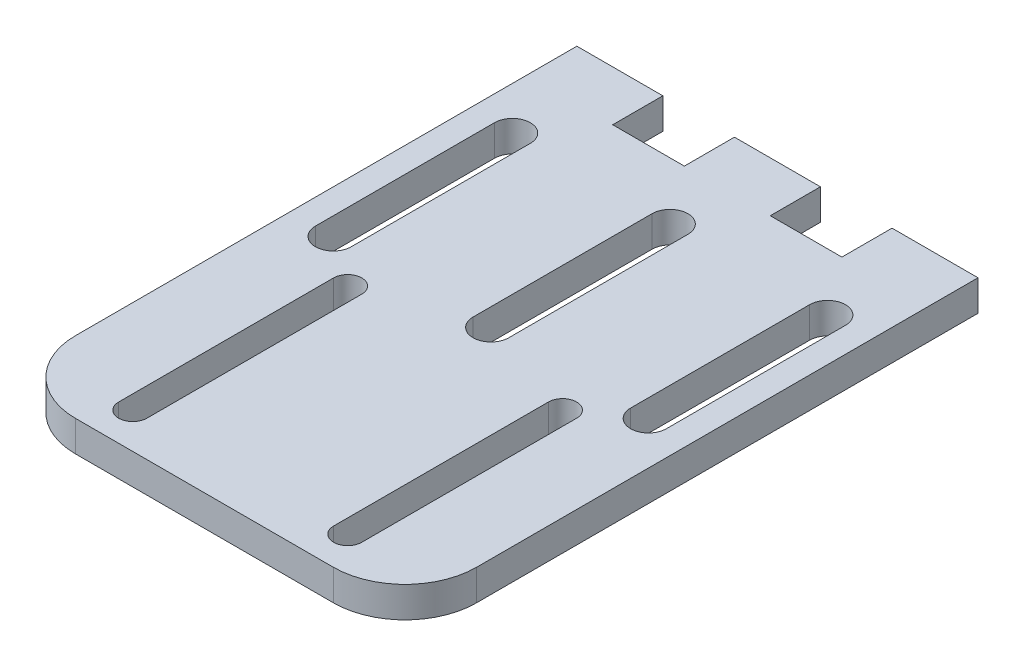
ISO-10303-21;
HEADER;
FILE_DESCRIPTION(('STEP AP214'),'2;1');
FILE_NAME('part.step','',(''),(''),'','','');
FILE_SCHEMA(('AUTOMOTIVE_DESIGN { 1 0 10303 214 1 1 1 1 }'));
ENDSEC;
DATA;
#1=APPLICATION_CONTEXT('core data for automotive mechanical design processes');
#2=APPLICATION_PROTOCOL_DEFINITION('international standard','automotive_design',2000,#1);
#3=PRODUCT_CONTEXT('',#1,'mechanical');
#4=PRODUCT('Part','Part','',(#3));
#5=PRODUCT_RELATED_PRODUCT_CATEGORY('part','',(#4));
#6=PRODUCT_DEFINITION_FORMATION('','',#4);
#7=PRODUCT_DEFINITION_CONTEXT('part definition',#1,'design');
#8=PRODUCT_DEFINITION('design','',#6,#7);
#9=PRODUCT_DEFINITION_SHAPE('','',#8);
#10=(LENGTH_UNIT() NAMED_UNIT(*) SI_UNIT(.MILLI.,.METRE.));
#11=(NAMED_UNIT(*) PLANE_ANGLE_UNIT() SI_UNIT($,.RADIAN.));
#12=(NAMED_UNIT(*) SI_UNIT($,.STERADIAN.) SOLID_ANGLE_UNIT());
#13=UNCERTAINTY_MEASURE_WITH_UNIT(LENGTH_MEASURE(1.E-05),#10,'distance_accuracy_value','');
#14=(GEOMETRIC_REPRESENTATION_CONTEXT(3) GLOBAL_UNCERTAINTY_ASSIGNED_CONTEXT((#13)) GLOBAL_UNIT_ASSIGNED_CONTEXT((#10,
#11,#12)) REPRESENTATION_CONTEXT('',''));
#15=CARTESIAN_POINT('',(0.,0.,0.));
#16=DIRECTION('',(0.,0.,1.));
#17=DIRECTION('',(1.,0.,0.));
#18=AXIS2_PLACEMENT_3D('',#15,#16,#17);
#19=CARTESIAN_POINT('',(0.,4.3,0.));
#20=DIRECTION('',(0.,-1.,0.));
#21=DIRECTION('',(0.,0.,-1.));
#22=AXIS2_PLACEMENT_3D('',#19,#20,#21);
#23=PLANE('',#22);
#24=CARTESIAN_POINT('',(28.,4.3,-65.));
#25=DIRECTION('',(0.,1.,0.));
#26=DIRECTION('',(0.,0.,1.));
#27=AXIS2_PLACEMENT_3D('',#24,#25,#26);
#28=CIRCLE('',#27,2.5);
#29=CARTESIAN_POINT('',(30.5,4.3,-65.));
#30=VERTEX_POINT('',#29);
#31=CARTESIAN_POINT('',(25.5,4.3,-65.));
#32=VERTEX_POINT('',#31);
#33=EDGE_CURVE('E310',#30,#32,#28,.T.);
#34=ORIENTED_EDGE('',*,*,#33,.F.);
#35=DIRECTION('',(0.,0.,-1.));
#36=VECTOR('',#35,1.);
#37=CARTESIAN_POINT('',(30.5,4.3,-65.));
#38=LINE('',#37,#36);
#39=CARTESIAN_POINT('',(30.5,4.3,-40.));
#40=VERTEX_POINT('',#39);
#41=EDGE_CURVE('E318',#40,#30,#38,.T.);
#42=ORIENTED_EDGE('',*,*,#41,.F.);
#43=CARTESIAN_POINT('',(28.,4.3,-40.));
#44=DIRECTION('',(0.,1.,0.));
#45=DIRECTION('',(0.,0.,1.));
#46=AXIS2_PLACEMENT_3D('',#43,#44,#45);
#47=CIRCLE('',#46,2.5);
#48=CARTESIAN_POINT('',(25.5,4.3,-40.));
#49=VERTEX_POINT('',#48);
#50=EDGE_CURVE('E315',#49,#40,#47,.T.);
#51=ORIENTED_EDGE('',*,*,#50,.F.);
#52=DIRECTION('',(0.,0.,1.));
#53=VECTOR('',#52,1.);
#54=CARTESIAN_POINT('',(25.5,4.3,-65.));
#55=LINE('',#54,#53);
#56=EDGE_CURVE('E312',#32,#49,#55,.T.);
#57=ORIENTED_EDGE('',*,*,#56,.F.);
#58=EDGE_LOOP('',(#34,#42,#51,#57));
#59=FACE_BOUND('',#58,.T.);
#60=CARTESIAN_POINT('',(6.,4.3,-65.));
#61=DIRECTION('',(0.,1.,0.));
#62=DIRECTION('',(0.,0.,1.));
#63=AXIS2_PLACEMENT_3D('',#60,#61,#62);
#64=CIRCLE('',#63,2.5);
#65=CARTESIAN_POINT('',(8.5,4.3,-65.));
#66=VERTEX_POINT('',#65);
#67=CARTESIAN_POINT('',(3.5,4.3,-65.));
#68=VERTEX_POINT('',#67);
#69=EDGE_CURVE('E372',#66,#68,#64,.T.);
#70=ORIENTED_EDGE('',*,*,#69,.F.);
#71=DIRECTION('',(0.,0.,-1.));
#72=VECTOR('',#71,1.);
#73=CARTESIAN_POINT('',(8.5,4.3,-65.));
#74=LINE('',#73,#72);
#75=CARTESIAN_POINT('',(8.5,4.3,-40.));
#76=VERTEX_POINT('',#75);
#77=EDGE_CURVE('E380',#76,#66,#74,.T.);
#78=ORIENTED_EDGE('',*,*,#77,.F.);
#79=CARTESIAN_POINT('',(6.,4.3,-40.));
#80=DIRECTION('',(0.,1.,0.));
#81=DIRECTION('',(0.,0.,1.));
#82=AXIS2_PLACEMENT_3D('',#79,#80,#81);
#83=CIRCLE('',#82,2.5);
#84=CARTESIAN_POINT('',(3.5,4.3,-40.));
#85=VERTEX_POINT('',#84);
#86=EDGE_CURVE('E377',#85,#76,#83,.T.);
#87=ORIENTED_EDGE('',*,*,#86,.F.);
#88=DIRECTION('',(0.,0.,1.));
#89=VECTOR('',#88,1.);
#90=CARTESIAN_POINT('',(3.5,4.3,-65.));
#91=LINE('',#90,#89);
#92=EDGE_CURVE('E374',#68,#85,#91,.T.);
#93=ORIENTED_EDGE('',*,*,#92,.F.);
#94=EDGE_LOOP('',(#70,#78,#87,#93));
#95=FACE_BOUND('',#94,.T.);
#96=DIRECTION('',(1.,0.,0.));
#97=VECTOR('',#96,1.);
#98=CARTESIAN_POINT('',(56.,4.3,0.));
#99=LINE('',#98,#97);
#100=CARTESIAN_POINT('',(10.,4.3,0.));
#101=VERTEX_POINT('',#100);
#102=CARTESIAN_POINT('',(46.,4.3,0.));
#103=VERTEX_POINT('',#102);
#104=EDGE_CURVE('E434',#101,#103,#99,.T.);
#105=ORIENTED_EDGE('',*,*,#104,.T.);
#106=CARTESIAN_POINT('',(46.,4.3,-10.));
#107=DIRECTION('',(0.,-1.,0.));
#108=DIRECTION('',(0.,0.,-1.));
#109=AXIS2_PLACEMENT_3D('',#106,#107,#108);
#110=CIRCLE('',#109,10.);
#111=CARTESIAN_POINT('',(56.,4.3,-10.));
#112=VERTEX_POINT('',#111);
#113=EDGE_CURVE('E53',#103,#112,#110,.F.);
#114=ORIENTED_EDGE('',*,*,#113,.T.);
#115=DIRECTION('',(0.,0.,-1.));
#116=VECTOR('',#115,1.);
#117=CARTESIAN_POINT('',(56.,4.3,-80.));
#118=LINE('',#117,#116);
#119=CARTESIAN_POINT('',(56.,4.3,-80.));
#120=VERTEX_POINT('',#119);
#121=EDGE_CURVE('E436',#112,#120,#118,.T.);
#122=ORIENTED_EDGE('',*,*,#121,.T.);
#123=DIRECTION('',(-1.,0.,0.));
#124=VECTOR('',#123,1.);
#125=CARTESIAN_POINT('',(44.,4.3,-80.));
#126=LINE('',#125,#124);
#127=CARTESIAN_POINT('',(44.,4.3,-80.));
#128=VERTEX_POINT('',#127);
#129=EDGE_CURVE('E439',#120,#128,#126,.T.);
#130=ORIENTED_EDGE('',*,*,#129,.T.);
#131=DIRECTION('',(0.,0.,1.));
#132=VECTOR('',#131,1.);
#133=CARTESIAN_POINT('',(44.,4.3,-73.));
#134=LINE('',#133,#132);
#135=CARTESIAN_POINT('',(44.,4.3,-73.));
#136=VERTEX_POINT('',#135);
#137=EDGE_CURVE('E441',#128,#136,#134,.T.);
#138=ORIENTED_EDGE('',*,*,#137,.T.);
#139=DIRECTION('',(-1.,0.,0.));
#140=VECTOR('',#139,1.);
#141=CARTESIAN_POINT('',(34.,4.3,-73.));
#142=LINE('',#141,#140);
#143=CARTESIAN_POINT('',(34.,4.3,-73.));
#144=VERTEX_POINT('',#143);
#145=EDGE_CURVE('E443',#136,#144,#142,.T.);
#146=ORIENTED_EDGE('',*,*,#145,.T.);
#147=DIRECTION('',(0.,0.,-1.));
#148=VECTOR('',#147,1.);
#149=CARTESIAN_POINT('',(34.,4.3,-80.));
#150=LINE('',#149,#148);
#151=CARTESIAN_POINT('',(34.,4.3,-80.));
#152=VERTEX_POINT('',#151);
#153=EDGE_CURVE('E445',#144,#152,#150,.T.);
#154=ORIENTED_EDGE('',*,*,#153,.T.);
#155=DIRECTION('',(-1.,0.,0.));
#156=VECTOR('',#155,1.);
#157=CARTESIAN_POINT('',(22.,4.3,-80.));
#158=LINE('',#157,#156);
#159=CARTESIAN_POINT('',(22.,4.3,-80.));
#160=VERTEX_POINT('',#159);
#161=EDGE_CURVE('E447',#152,#160,#158,.T.);
#162=ORIENTED_EDGE('',*,*,#161,.T.);
#163=DIRECTION('',(0.,0.,1.));
#164=VECTOR('',#163,1.);
#165=CARTESIAN_POINT('',(22.,4.3,-73.));
#166=LINE('',#165,#164);
#167=CARTESIAN_POINT('',(22.,4.3,-73.));
#168=VERTEX_POINT('',#167);
#169=EDGE_CURVE('E449',#160,#168,#166,.T.);
#170=ORIENTED_EDGE('',*,*,#169,.T.);
#171=DIRECTION('',(-1.,0.,0.));
#172=VECTOR('',#171,1.);
#173=CARTESIAN_POINT('',(12.,4.3,-73.));
#174=LINE('',#173,#172);
#175=CARTESIAN_POINT('',(12.,4.3,-73.));
#176=VERTEX_POINT('',#175);
#177=EDGE_CURVE('E451',#168,#176,#174,.T.);
#178=ORIENTED_EDGE('',*,*,#177,.T.);
#179=DIRECTION('',(0.,0.,-1.));
#180=VECTOR('',#179,1.);
#181=CARTESIAN_POINT('',(12.,4.3,-80.));
#182=LINE('',#181,#180);
#183=CARTESIAN_POINT('',(12.,4.3,-80.));
#184=VERTEX_POINT('',#183);
#185=EDGE_CURVE('E453',#176,#184,#182,.T.);
#186=ORIENTED_EDGE('',*,*,#185,.T.);
#187=DIRECTION('',(-1.,0.,0.));
#188=VECTOR('',#187,1.);
#189=CARTESIAN_POINT('',(0.,4.3,-80.));
#190=LINE('',#189,#188);
#191=CARTESIAN_POINT('',(0.,4.3,-80.));
#192=VERTEX_POINT('',#191);
#193=EDGE_CURVE('E455',#184,#192,#190,.T.);
#194=ORIENTED_EDGE('',*,*,#193,.T.);
#195=DIRECTION('',(0.,0.,1.));
#196=VECTOR('',#195,1.);
#197=CARTESIAN_POINT('',(0.,4.3,0.));
#198=LINE('',#197,#196);
#199=CARTESIAN_POINT('',(0.,4.3,-10.));
#200=VERTEX_POINT('',#199);
#201=EDGE_CURVE('E457',#192,#200,#198,.T.);
#202=ORIENTED_EDGE('',*,*,#201,.T.);
#203=CARTESIAN_POINT('',(10.,4.3,-10.));
#204=DIRECTION('',(0.,-1.,0.));
#205=DIRECTION('',(0.,0.,-1.));
#206=AXIS2_PLACEMENT_3D('',#203,#204,#205);
#207=CIRCLE('',#206,10.);
#208=EDGE_CURVE('E522',#200,#101,#207,.F.);
#209=ORIENTED_EDGE('',*,*,#208,.T.);
#210=EDGE_LOOP('',(#105,#114,#122,#130,#138,#146,#154,#162,#170,#178,#186,#194,#202,#209));
#211=FACE_BOUND('',#210,.T.);
#212=CARTESIAN_POINT('',(13.,4.3,-35.));
#213=DIRECTION('',(0.,1.,0.));
#214=DIRECTION('',(0.,0.,1.));
#215=AXIS2_PLACEMENT_3D('',#212,#213,#214);
#216=CIRCLE('',#215,1.9669531472381);
#217=CARTESIAN_POINT('',(14.9669531472381,4.3,-35.));
#218=VERTEX_POINT('',#217);
#219=CARTESIAN_POINT('',(11.0330468527619,4.3,-35.));
#220=VERTEX_POINT('',#219);
#221=EDGE_CURVE('E403',#218,#220,#216,.T.);
#222=ORIENTED_EDGE('',*,*,#221,.F.);
#223=DIRECTION('',(0.,0.,-1.));
#224=VECTOR('',#223,1.);
#225=CARTESIAN_POINT('',(14.9669531472381,4.3,-35.));
#226=LINE('',#225,#224);
#227=CARTESIAN_POINT('',(14.9669531472381,4.3,-5.));
#228=VERTEX_POINT('',#227);
#229=EDGE_CURVE('E411',#228,#218,#226,.T.);
#230=ORIENTED_EDGE('',*,*,#229,.F.);
#231=CARTESIAN_POINT('',(13.,4.3,-5.));
#232=DIRECTION('',(0.,1.,0.));
#233=DIRECTION('',(0.,0.,1.));
#234=AXIS2_PLACEMENT_3D('',#231,#232,#233);
#235=CIRCLE('',#234,1.9669531472381);
#236=CARTESIAN_POINT('',(11.0330468527619,4.3,-5.));
#237=VERTEX_POINT('',#236);
#238=EDGE_CURVE('E408',#237,#228,#235,.T.);
#239=ORIENTED_EDGE('',*,*,#238,.F.);
#240=DIRECTION('',(0.,0.,1.));
#241=VECTOR('',#240,1.);
#242=CARTESIAN_POINT('',(11.0330468527619,4.3,-35.));
#243=LINE('',#242,#241);
#244=EDGE_CURVE('E405',#220,#237,#243,.T.);
#245=ORIENTED_EDGE('',*,*,#244,.F.);
#246=EDGE_LOOP('',(#222,#230,#239,#245));
#247=FACE_BOUND('',#246,.T.);
#248=CARTESIAN_POINT('',(43.,4.3,-35.));
#249=DIRECTION('',(0.,1.,0.));
#250=DIRECTION('',(0.,0.,-1.));
#251=AXIS2_PLACEMENT_3D('',#248,#249,#250);
#252=CIRCLE('',#251,1.9669531472381);
#253=CARTESIAN_POINT('',(44.9669531472381,4.3,-35.));
#254=VERTEX_POINT('',#253);
#255=CARTESIAN_POINT('',(41.0330468527619,4.3,-35.));
#256=VERTEX_POINT('',#255);
#257=EDGE_CURVE('E341',#254,#256,#252,.T.);
#258=ORIENTED_EDGE('',*,*,#257,.F.);
#259=DIRECTION('',(0.,0.,-1.));
#260=VECTOR('',#259,1.);
#261=CARTESIAN_POINT('',(44.9669531472381,4.3,-35.));
#262=LINE('',#261,#260);
#263=CARTESIAN_POINT('',(44.9669531472381,4.3,-5.00000000000001));
#264=VERTEX_POINT('',#263);
#265=EDGE_CURVE('E349',#264,#254,#262,.T.);
#266=ORIENTED_EDGE('',*,*,#265,.F.);
#267=CARTESIAN_POINT('',(43.,4.3,-5.00000000000001));
#268=DIRECTION('',(0.,1.,0.));
#269=DIRECTION('',(0.,0.,-1.));
#270=AXIS2_PLACEMENT_3D('',#267,#268,#269);
#271=CIRCLE('',#270,1.9669531472381);
#272=CARTESIAN_POINT('',(41.0330468527619,4.3,-5.00000000000001));
#273=VERTEX_POINT('',#272);
#274=EDGE_CURVE('E346',#273,#264,#271,.T.);
#275=ORIENTED_EDGE('',*,*,#274,.F.);
#276=DIRECTION('',(0.,0.,1.));
#277=VECTOR('',#276,1.);
#278=CARTESIAN_POINT('',(41.0330468527619,4.3,-35.));
#279=LINE('',#278,#277);
#280=EDGE_CURVE('E343',#256,#273,#279,.T.);
#281=ORIENTED_EDGE('',*,*,#280,.F.);
#282=EDGE_LOOP('',(#258,#266,#275,#281));
#283=FACE_BOUND('',#282,.T.);
#284=CARTESIAN_POINT('',(50.,4.3,-65.));
#285=DIRECTION('',(0.,1.,0.));
#286=DIRECTION('',(0.,0.,1.));
#287=AXIS2_PLACEMENT_3D('',#284,#285,#286);
#288=CIRCLE('',#287,2.5);
#289=CARTESIAN_POINT('',(52.5,4.3,-65.));
#290=VERTEX_POINT('',#289);
#291=CARTESIAN_POINT('',(47.5,4.3,-65.));
#292=VERTEX_POINT('',#291);
#293=EDGE_CURVE('E269',#290,#292,#288,.T.);
#294=ORIENTED_EDGE('',*,*,#293,.F.);
#295=DIRECTION('',(0.,0.,-1.));
#296=VECTOR('',#295,1.);
#297=CARTESIAN_POINT('',(52.5,4.3,-65.));
#298=LINE('',#297,#296);
#299=CARTESIAN_POINT('',(52.5,4.3,-40.));
#300=VERTEX_POINT('',#299);
#301=EDGE_CURVE('E294',#300,#290,#298,.T.);
#302=ORIENTED_EDGE('',*,*,#301,.F.);
#303=CARTESIAN_POINT('',(50.,4.3,-40.));
#304=DIRECTION('',(0.,1.,0.));
#305=DIRECTION('',(0.,0.,1.));
#306=AXIS2_PLACEMENT_3D('',#303,#304,#305);
#307=CIRCLE('',#306,2.5);
#308=CARTESIAN_POINT('',(47.5,4.3,-40.));
#309=VERTEX_POINT('',#308);
#310=EDGE_CURVE('E292',#309,#300,#307,.T.);
#311=ORIENTED_EDGE('',*,*,#310,.F.);
#312=DIRECTION('',(0.,0.,1.));
#313=VECTOR('',#312,1.);
#314=CARTESIAN_POINT('',(47.5,4.3,-65.));
#315=LINE('',#314,#313);
#316=EDGE_CURVE('E279',#292,#309,#315,.T.);
#317=ORIENTED_EDGE('',*,*,#316,.F.);
#318=EDGE_LOOP('',(#294,#302,#311,#317));
#319=FACE_BOUND('',#318,.T.);
#320=ADVANCED_FACE('F45',(#59,#95,#211,#247,#283,#319),#23,.F.);
#321=CARTESIAN_POINT('',(0.,0.,0.));
#322=DIRECTION('',(0.,-1.,0.));
#323=DIRECTION('',(0.,0.,-1.));
#324=AXIS2_PLACEMENT_3D('',#321,#322,#323);
#325=PLANE('',#324);
#326=DIRECTION('',(0.,0.,-1.));
#327=VECTOR('',#326,1.);
#328=CARTESIAN_POINT('',(56.,0.,-80.));
#329=LINE('',#328,#327);
#330=CARTESIAN_POINT('',(56.,0.,-10.));
#331=VERTEX_POINT('',#330);
#332=CARTESIAN_POINT('',(56.,0.,-80.));
#333=VERTEX_POINT('',#332);
#334=EDGE_CURVE('E461',#331,#333,#329,.T.);
#335=ORIENTED_EDGE('',*,*,#334,.F.);
#336=CARTESIAN_POINT('',(46.,0.,-10.));
#337=DIRECTION('',(0.,-1.,0.));
#338=DIRECTION('',(0.,0.,-1.));
#339=AXIS2_PLACEMENT_3D('',#336,#337,#338);
#340=CIRCLE('',#339,10.);
#341=CARTESIAN_POINT('',(46.,0.,0.));
#342=VERTEX_POINT('',#341);
#343=EDGE_CURVE('E516',#331,#342,#340,.T.);
#344=ORIENTED_EDGE('',*,*,#343,.T.);
#345=DIRECTION('',(1.,0.,0.));
#346=VECTOR('',#345,1.);
#347=CARTESIAN_POINT('',(56.,0.,0.));
#348=LINE('',#347,#346);
#349=CARTESIAN_POINT('',(10.,0.,0.));
#350=VERTEX_POINT('',#349);
#351=EDGE_CURVE('E433',#350,#342,#348,.T.);
#352=ORIENTED_EDGE('',*,*,#351,.F.);
#353=CARTESIAN_POINT('',(10.,0.,-10.));
#354=DIRECTION('',(0.,-1.,0.));
#355=DIRECTION('',(0.,0.,-1.));
#356=AXIS2_PLACEMENT_3D('',#353,#354,#355);
#357=CIRCLE('',#356,10.);
#358=CARTESIAN_POINT('',(0.,0.,-10.));
#359=VERTEX_POINT('',#358);
#360=EDGE_CURVE('E514',#350,#359,#357,.T.);
#361=ORIENTED_EDGE('',*,*,#360,.T.);
#362=DIRECTION('',(0.,0.,1.));
#363=VECTOR('',#362,1.);
#364=CARTESIAN_POINT('',(0.,0.,0.));
#365=LINE('',#364,#363);
#366=CARTESIAN_POINT('',(0.,0.,-80.));
#367=VERTEX_POINT('',#366);
#368=EDGE_CURVE('E437',#367,#359,#365,.T.);
#369=ORIENTED_EDGE('',*,*,#368,.F.);
#370=DIRECTION('',(-1.,0.,0.));
#371=VECTOR('',#370,1.);
#372=CARTESIAN_POINT('',(0.,0.,-80.));
#373=LINE('',#372,#371);
#374=CARTESIAN_POINT('',(12.,0.,-80.));
#375=VERTEX_POINT('',#374);
#376=EDGE_CURVE('E479',#375,#367,#373,.T.);
#377=ORIENTED_EDGE('',*,*,#376,.F.);
#378=DIRECTION('',(0.,0.,-1.));
#379=VECTOR('',#378,1.);
#380=CARTESIAN_POINT('',(12.,0.,-80.));
#381=LINE('',#380,#379);
#382=CARTESIAN_POINT('',(12.,0.,-73.));
#383=VERTEX_POINT('',#382);
#384=EDGE_CURVE('E477',#383,#375,#381,.T.);
#385=ORIENTED_EDGE('',*,*,#384,.F.);
#386=DIRECTION('',(-1.,0.,0.));
#387=VECTOR('',#386,1.);
#388=CARTESIAN_POINT('',(12.,0.,-73.));
#389=LINE('',#388,#387);
#390=CARTESIAN_POINT('',(22.,0.,-73.));
#391=VERTEX_POINT('',#390);
#392=EDGE_CURVE('E475',#391,#383,#389,.T.);
#393=ORIENTED_EDGE('',*,*,#392,.F.);
#394=DIRECTION('',(0.,0.,1.));
#395=VECTOR('',#394,1.);
#396=CARTESIAN_POINT('',(22.,0.,-73.));
#397=LINE('',#396,#395);
#398=CARTESIAN_POINT('',(22.,0.,-80.));
#399=VERTEX_POINT('',#398);
#400=EDGE_CURVE('E473',#399,#391,#397,.T.);
#401=ORIENTED_EDGE('',*,*,#400,.F.);
#402=DIRECTION('',(-1.,0.,0.));
#403=VECTOR('',#402,1.);
#404=CARTESIAN_POINT('',(22.,0.,-80.));
#405=LINE('',#404,#403);
#406=CARTESIAN_POINT('',(34.,0.,-80.));
#407=VERTEX_POINT('',#406);
#408=EDGE_CURVE('E471',#407,#399,#405,.T.);
#409=ORIENTED_EDGE('',*,*,#408,.F.);
#410=DIRECTION('',(0.,0.,-1.));
#411=VECTOR('',#410,1.);
#412=CARTESIAN_POINT('',(34.,0.,-80.));
#413=LINE('',#412,#411);
#414=CARTESIAN_POINT('',(34.,0.,-73.));
#415=VERTEX_POINT('',#414);
#416=EDGE_CURVE('E469',#415,#407,#413,.T.);
#417=ORIENTED_EDGE('',*,*,#416,.F.);
#418=DIRECTION('',(-1.,0.,0.));
#419=VECTOR('',#418,1.);
#420=CARTESIAN_POINT('',(34.,0.,-73.));
#421=LINE('',#420,#419);
#422=CARTESIAN_POINT('',(44.,0.,-73.));
#423=VERTEX_POINT('',#422);
#424=EDGE_CURVE('E467',#423,#415,#421,.T.);
#425=ORIENTED_EDGE('',*,*,#424,.F.);
#426=DIRECTION('',(0.,0.,1.));
#427=VECTOR('',#426,1.);
#428=CARTESIAN_POINT('',(44.,0.,-73.));
#429=LINE('',#428,#427);
#430=CARTESIAN_POINT('',(44.,0.,-80.));
#431=VERTEX_POINT('',#430);
#432=EDGE_CURVE('E465',#431,#423,#429,.T.);
#433=ORIENTED_EDGE('',*,*,#432,.F.);
#434=DIRECTION('',(-1.,0.,0.));
#435=VECTOR('',#434,1.);
#436=CARTESIAN_POINT('',(44.,0.,-80.));
#437=LINE('',#436,#435);
#438=EDGE_CURVE('E463',#333,#431,#437,.T.);
#439=ORIENTED_EDGE('',*,*,#438,.F.);
#440=EDGE_LOOP('',(#335,#344,#352,#361,#369,#377,#385,#393,#401,#409,#417,#425,#433,#439));
#441=FACE_BOUND('',#440,.T.);
#442=DIRECTION('',(0.,0.,-1.));
#443=VECTOR('',#442,1.);
#444=CARTESIAN_POINT('',(14.9669531472381,0.,-35.));
#445=LINE('',#444,#443);
#446=CARTESIAN_POINT('',(14.9669531472381,0.,-5.));
#447=VERTEX_POINT('',#446);
#448=CARTESIAN_POINT('',(14.9669531472381,0.,-35.));
#449=VERTEX_POINT('',#448);
#450=EDGE_CURVE('E406',#447,#449,#445,.T.);
#451=ORIENTED_EDGE('',*,*,#450,.T.);
#452=CARTESIAN_POINT('',(13.,0.,-35.));
#453=DIRECTION('',(0.,1.,0.));
#454=DIRECTION('',(0.,0.,1.));
#455=AXIS2_PLACEMENT_3D('',#452,#453,#454);
#456=CIRCLE('',#455,1.9669531472381);
#457=CARTESIAN_POINT('',(11.0330468527619,0.,-35.));
#458=VERTEX_POINT('',#457);
#459=EDGE_CURVE('E402',#449,#458,#456,.T.);
#460=ORIENTED_EDGE('',*,*,#459,.T.);
#461=DIRECTION('',(0.,0.,1.));
#462=VECTOR('',#461,1.);
#463=CARTESIAN_POINT('',(11.0330468527619,0.,-35.));
#464=LINE('',#463,#462);
#465=CARTESIAN_POINT('',(11.0330468527619,0.,-5.));
#466=VERTEX_POINT('',#465);
#467=EDGE_CURVE('E416',#458,#466,#464,.T.);
#468=ORIENTED_EDGE('',*,*,#467,.T.);
#469=CARTESIAN_POINT('',(13.,0.,-5.));
#470=DIRECTION('',(0.,1.,0.));
#471=DIRECTION('',(0.,0.,1.));
#472=AXIS2_PLACEMENT_3D('',#469,#470,#471);
#473=CIRCLE('',#472,1.9669531472381);
#474=EDGE_CURVE('E419',#466,#447,#473,.T.);
#475=ORIENTED_EDGE('',*,*,#474,.T.);
#476=EDGE_LOOP('',(#451,#460,#468,#475));
#477=FACE_BOUND('',#476,.T.);
#478=DIRECTION('',(0.,0.,-1.));
#479=VECTOR('',#478,1.);
#480=CARTESIAN_POINT('',(8.5,0.,-65.));
#481=LINE('',#480,#479);
#482=CARTESIAN_POINT('',(8.5,0.,-40.));
#483=VERTEX_POINT('',#482);
#484=CARTESIAN_POINT('',(8.5,0.,-65.));
#485=VERTEX_POINT('',#484);
#486=EDGE_CURVE('E375',#483,#485,#481,.T.);
#487=ORIENTED_EDGE('',*,*,#486,.T.);
#488=CARTESIAN_POINT('',(6.,0.,-65.));
#489=DIRECTION('',(0.,1.,0.));
#490=DIRECTION('',(0.,0.,1.));
#491=AXIS2_PLACEMENT_3D('',#488,#489,#490);
#492=CIRCLE('',#491,2.5);
#493=CARTESIAN_POINT('',(3.5,0.,-65.));
#494=VERTEX_POINT('',#493);
#495=EDGE_CURVE('E371',#485,#494,#492,.T.);
#496=ORIENTED_EDGE('',*,*,#495,.T.);
#497=DIRECTION('',(0.,0.,1.));
#498=VECTOR('',#497,1.);
#499=CARTESIAN_POINT('',(3.5,0.,-65.));
#500=LINE('',#499,#498);
#501=CARTESIAN_POINT('',(3.5,0.,-40.));
#502=VERTEX_POINT('',#501);
#503=EDGE_CURVE('E385',#494,#502,#500,.T.);
#504=ORIENTED_EDGE('',*,*,#503,.T.);
#505=CARTESIAN_POINT('',(6.,0.,-40.));
#506=DIRECTION('',(0.,1.,0.));
#507=DIRECTION('',(0.,0.,1.));
#508=AXIS2_PLACEMENT_3D('',#505,#506,#507);
#509=CIRCLE('',#508,2.5);
#510=EDGE_CURVE('E388',#502,#483,#509,.T.);
#511=ORIENTED_EDGE('',*,*,#510,.T.);
#512=EDGE_LOOP('',(#487,#496,#504,#511));
#513=FACE_BOUND('',#512,.T.);
#514=DIRECTION('',(0.,0.,-1.));
#515=VECTOR('',#514,1.);
#516=CARTESIAN_POINT('',(44.9669531472381,0.,-35.));
#517=LINE('',#516,#515);
#518=CARTESIAN_POINT('',(44.9669531472381,0.,-5.00000000000001));
#519=VERTEX_POINT('',#518);
#520=CARTESIAN_POINT('',(44.9669531472381,0.,-35.));
#521=VERTEX_POINT('',#520);
#522=EDGE_CURVE('E344',#519,#521,#517,.T.);
#523=ORIENTED_EDGE('',*,*,#522,.T.);
#524=CARTESIAN_POINT('',(43.,0.,-35.));
#525=DIRECTION('',(0.,1.,0.));
#526=DIRECTION('',(0.,0.,-1.));
#527=AXIS2_PLACEMENT_3D('',#524,#525,#526);
#528=CIRCLE('',#527,1.9669531472381);
#529=CARTESIAN_POINT('',(41.0330468527619,0.,-35.));
#530=VERTEX_POINT('',#529);
#531=EDGE_CURVE('E340',#521,#530,#528,.T.);
#532=ORIENTED_EDGE('',*,*,#531,.T.);
#533=DIRECTION('',(0.,0.,1.));
#534=VECTOR('',#533,1.);
#535=CARTESIAN_POINT('',(41.0330468527619,0.,-35.));
#536=LINE('',#535,#534);
#537=CARTESIAN_POINT('',(41.0330468527619,0.,-5.00000000000001));
#538=VERTEX_POINT('',#537);
#539=EDGE_CURVE('E354',#530,#538,#536,.T.);
#540=ORIENTED_EDGE('',*,*,#539,.T.);
#541=CARTESIAN_POINT('',(43.,0.,-5.00000000000001));
#542=DIRECTION('',(0.,1.,0.));
#543=DIRECTION('',(0.,0.,-1.));
#544=AXIS2_PLACEMENT_3D('',#541,#542,#543);
#545=CIRCLE('',#544,1.9669531472381);
#546=EDGE_CURVE('E357',#538,#519,#545,.T.);
#547=ORIENTED_EDGE('',*,*,#546,.T.);
#548=EDGE_LOOP('',(#523,#532,#540,#547));
#549=FACE_BOUND('',#548,.T.);
#550=DIRECTION('',(0.,0.,-1.));
#551=VECTOR('',#550,1.);
#552=CARTESIAN_POINT('',(30.5,0.,-65.));
#553=LINE('',#552,#551);
#554=CARTESIAN_POINT('',(30.5,0.,-40.));
#555=VERTEX_POINT('',#554);
#556=CARTESIAN_POINT('',(30.5,0.,-65.));
#557=VERTEX_POINT('',#556);
#558=EDGE_CURVE('E313',#555,#557,#553,.T.);
#559=ORIENTED_EDGE('',*,*,#558,.T.);
#560=CARTESIAN_POINT('',(28.,0.,-65.));
#561=DIRECTION('',(0.,1.,0.));
#562=DIRECTION('',(0.,0.,1.));
#563=AXIS2_PLACEMENT_3D('',#560,#561,#562);
#564=CIRCLE('',#563,2.5);
#565=CARTESIAN_POINT('',(25.5,0.,-65.));
#566=VERTEX_POINT('',#565);
#567=EDGE_CURVE('E287',#557,#566,#564,.T.);
#568=ORIENTED_EDGE('',*,*,#567,.T.);
#569=DIRECTION('',(0.,0.,1.));
#570=VECTOR('',#569,1.);
#571=CARTESIAN_POINT('',(25.5,0.,-65.));
#572=LINE('',#571,#570);
#573=CARTESIAN_POINT('',(25.5,0.,-40.));
#574=VERTEX_POINT('',#573);
#575=EDGE_CURVE('E323',#566,#574,#572,.T.);
#576=ORIENTED_EDGE('',*,*,#575,.T.);
#577=CARTESIAN_POINT('',(28.,0.,-40.));
#578=DIRECTION('',(0.,1.,0.));
#579=DIRECTION('',(0.,0.,1.));
#580=AXIS2_PLACEMENT_3D('',#577,#578,#579);
#581=CIRCLE('',#580,2.5);
#582=EDGE_CURVE('E326',#574,#555,#581,.T.);
#583=ORIENTED_EDGE('',*,*,#582,.T.);
#584=EDGE_LOOP('',(#559,#568,#576,#583));
#585=FACE_BOUND('',#584,.T.);
#586=DIRECTION('',(0.,0.,-1.));
#587=VECTOR('',#586,1.);
#588=CARTESIAN_POINT('',(52.5,0.,-65.));
#589=LINE('',#588,#587);
#590=CARTESIAN_POINT('',(52.5,0.,-40.));
#591=VERTEX_POINT('',#590);
#592=CARTESIAN_POINT('',(52.5,0.,-65.));
#593=VERTEX_POINT('',#592);
#594=EDGE_CURVE('E280',#591,#593,#589,.T.);
#595=ORIENTED_EDGE('',*,*,#594,.T.);
#596=CARTESIAN_POINT('',(50.,0.,-65.));
#597=DIRECTION('',(0.,1.,0.));
#598=DIRECTION('',(0.,0.,1.));
#599=AXIS2_PLACEMENT_3D('',#596,#597,#598);
#600=CIRCLE('',#599,2.5);
#601=CARTESIAN_POINT('',(47.5,0.,-65.));
#602=VERTEX_POINT('',#601);
#603=EDGE_CURVE('E298',#593,#602,#600,.T.);
#604=ORIENTED_EDGE('',*,*,#603,.T.);
#605=DIRECTION('',(0.,0.,1.));
#606=VECTOR('',#605,1.);
#607=CARTESIAN_POINT('',(47.5,0.,-65.));
#608=LINE('',#607,#606);
#609=CARTESIAN_POINT('',(47.5,0.,-40.));
#610=VERTEX_POINT('',#609);
#611=EDGE_CURVE('E286',#602,#610,#608,.T.);
#612=ORIENTED_EDGE('',*,*,#611,.T.);
#613=CARTESIAN_POINT('',(50.,0.,-40.));
#614=DIRECTION('',(0.,1.,0.));
#615=DIRECTION('',(0.,0.,1.));
#616=AXIS2_PLACEMENT_3D('',#613,#614,#615);
#617=CIRCLE('',#616,2.5);
#618=EDGE_CURVE('E301',#610,#591,#617,.T.);
#619=ORIENTED_EDGE('',*,*,#618,.T.);
#620=EDGE_LOOP('',(#595,#604,#612,#619));
#621=FACE_BOUND('',#620,.T.);
#622=ADVANCED_FACE('F537',(#441,#477,#513,#549,#585,#621),#325,.T.);
#623=CARTESIAN_POINT('',(56.,4.3,0.));
#624=DIRECTION('',(0.,0.,-1.));
#625=DIRECTION('',(-1.,0.,0.));
#626=AXIS2_PLACEMENT_3D('',#623,#624,#625);
#627=PLANE('',#626);
#628=ORIENTED_EDGE('',*,*,#351,.T.);
#629=DIRECTION('',(0.,-1.,0.));
#630=VECTOR('',#629,1.);
#631=CARTESIAN_POINT('',(46.,4.3,0.));
#632=LINE('',#631,#630);
#633=EDGE_CURVE('E66',#342,#103,#632,.F.);
#634=ORIENTED_EDGE('',*,*,#633,.T.);
#635=ORIENTED_EDGE('',*,*,#104,.F.);
#636=DIRECTION('',(0.,-1.,0.));
#637=VECTOR('',#636,1.);
#638=CARTESIAN_POINT('',(10.,4.3,0.));
#639=LINE('',#638,#637);
#640=EDGE_CURVE('E518',#101,#350,#639,.T.);
#641=ORIENTED_EDGE('',*,*,#640,.T.);
#642=EDGE_LOOP('',(#628,#634,#635,#641));
#643=FACE_BOUND('',#642,.T.);
#644=ADVANCED_FACE('F540',(#643),#627,.F.);
#645=CARTESIAN_POINT('',(56.,4.3,-80.));
#646=DIRECTION('',(-1.,0.,0.));
#647=DIRECTION('',(0.,0.,1.));
#648=AXIS2_PLACEMENT_3D('',#645,#646,#647);
#649=PLANE('',#648);
#650=ORIENTED_EDGE('',*,*,#121,.F.);
#651=DIRECTION('',(0.,-1.,0.));
#652=VECTOR('',#651,1.);
#653=CARTESIAN_POINT('',(56.,4.3,-10.));
#654=LINE('',#653,#652);
#655=EDGE_CURVE('E511',#112,#331,#654,.T.);
#656=ORIENTED_EDGE('',*,*,#655,.T.);
#657=ORIENTED_EDGE('',*,*,#334,.T.);
#658=DIRECTION('',(0.,-1.,0.));
#659=VECTOR('',#658,1.);
#660=CARTESIAN_POINT('',(56.,4.3,-80.));
#661=LINE('',#660,#659);
#662=EDGE_CURVE('E508',#120,#333,#661,.T.);
#663=ORIENTED_EDGE('',*,*,#662,.F.);
#664=EDGE_LOOP('',(#650,#656,#657,#663));
#665=FACE_BOUND('',#664,.T.);
#666=ADVANCED_FACE('F531',(#665),#649,.F.);
#667=CARTESIAN_POINT('',(44.,4.3,-80.));
#668=DIRECTION('',(0.,0.,1.));
#669=DIRECTION('',(1.,0.,0.));
#670=AXIS2_PLACEMENT_3D('',#667,#668,#669);
#671=PLANE('',#670);
#672=ORIENTED_EDGE('',*,*,#438,.T.);
#673=DIRECTION('',(0.,-1.,0.));
#674=VECTOR('',#673,1.);
#675=CARTESIAN_POINT('',(44.,4.3,-80.));
#676=LINE('',#675,#674);
#677=EDGE_CURVE('E505',#128,#431,#676,.T.);
#678=ORIENTED_EDGE('',*,*,#677,.F.);
#679=ORIENTED_EDGE('',*,*,#129,.F.);
#680=ORIENTED_EDGE('',*,*,#662,.T.);
#681=EDGE_LOOP('',(#672,#678,#679,#680));
#682=FACE_BOUND('',#681,.T.);
#683=ADVANCED_FACE('F588',(#682),#671,.F.);
#684=CARTESIAN_POINT('',(44.,4.3,-73.));
#685=DIRECTION('',(1.,0.,0.));
#686=DIRECTION('',(0.,0.,-1.));
#687=AXIS2_PLACEMENT_3D('',#684,#685,#686);
#688=PLANE('',#687);
#689=ORIENTED_EDGE('',*,*,#432,.T.);
#690=DIRECTION('',(0.,-1.,0.));
#691=VECTOR('',#690,1.);
#692=CARTESIAN_POINT('',(44.,4.3,-73.));
#693=LINE('',#692,#691);
#694=EDGE_CURVE('E502',#136,#423,#693,.T.);
#695=ORIENTED_EDGE('',*,*,#694,.F.);
#696=ORIENTED_EDGE('',*,*,#137,.F.);
#697=ORIENTED_EDGE('',*,*,#677,.T.);
#698=EDGE_LOOP('',(#689,#695,#696,#697));
#699=FACE_BOUND('',#698,.T.);
#700=ADVANCED_FACE('F584',(#699),#688,.F.);
#701=CARTESIAN_POINT('',(34.,4.3,-73.));
#702=DIRECTION('',(0.,0.,1.));
#703=DIRECTION('',(1.,0.,0.));
#704=AXIS2_PLACEMENT_3D('',#701,#702,#703);
#705=PLANE('',#704);
#706=ORIENTED_EDGE('',*,*,#424,.T.);
#707=DIRECTION('',(0.,-1.,0.));
#708=VECTOR('',#707,1.);
#709=CARTESIAN_POINT('',(34.,4.3,-73.));
#710=LINE('',#709,#708);
#711=EDGE_CURVE('E499',#144,#415,#710,.T.);
#712=ORIENTED_EDGE('',*,*,#711,.F.);
#713=ORIENTED_EDGE('',*,*,#145,.F.);
#714=ORIENTED_EDGE('',*,*,#694,.T.);
#715=EDGE_LOOP('',(#706,#712,#713,#714));
#716=FACE_BOUND('',#715,.T.);
#717=ADVANCED_FACE('F580',(#716),#705,.F.);
#718=CARTESIAN_POINT('',(34.,4.3,-80.));
#719=DIRECTION('',(-1.,0.,0.));
#720=DIRECTION('',(0.,0.,1.));
#721=AXIS2_PLACEMENT_3D('',#718,#719,#720);
#722=PLANE('',#721);
#723=ORIENTED_EDGE('',*,*,#416,.T.);
#724=DIRECTION('',(0.,-1.,0.));
#725=VECTOR('',#724,1.);
#726=CARTESIAN_POINT('',(34.,4.3,-80.));
#727=LINE('',#726,#725);
#728=EDGE_CURVE('E496',#152,#407,#727,.T.);
#729=ORIENTED_EDGE('',*,*,#728,.F.);
#730=ORIENTED_EDGE('',*,*,#153,.F.);
#731=ORIENTED_EDGE('',*,*,#711,.T.);
#732=EDGE_LOOP('',(#723,#729,#730,#731));
#733=FACE_BOUND('',#732,.T.);
#734=ADVANCED_FACE('F576',(#733),#722,.F.);
#735=CARTESIAN_POINT('',(22.,4.3,-80.));
#736=DIRECTION('',(0.,0.,1.));
#737=DIRECTION('',(1.,0.,0.));
#738=AXIS2_PLACEMENT_3D('',#735,#736,#737);
#739=PLANE('',#738);
#740=ORIENTED_EDGE('',*,*,#408,.T.);
#741=DIRECTION('',(0.,-1.,0.));
#742=VECTOR('',#741,1.);
#743=CARTESIAN_POINT('',(22.,4.3,-80.));
#744=LINE('',#743,#742);
#745=EDGE_CURVE('E493',#160,#399,#744,.T.);
#746=ORIENTED_EDGE('',*,*,#745,.F.);
#747=ORIENTED_EDGE('',*,*,#161,.F.);
#748=ORIENTED_EDGE('',*,*,#728,.T.);
#749=EDGE_LOOP('',(#740,#746,#747,#748));
#750=FACE_BOUND('',#749,.T.);
#751=ADVANCED_FACE('F571',(#750),#739,.F.);
#752=CARTESIAN_POINT('',(22.,4.3,-73.));
#753=DIRECTION('',(1.,0.,0.));
#754=DIRECTION('',(0.,0.,-1.));
#755=AXIS2_PLACEMENT_3D('',#752,#753,#754);
#756=PLANE('',#755);
#757=ORIENTED_EDGE('',*,*,#400,.T.);
#758=DIRECTION('',(0.,-1.,0.));
#759=VECTOR('',#758,1.);
#760=CARTESIAN_POINT('',(22.,4.3,-73.));
#761=LINE('',#760,#759);
#762=EDGE_CURVE('E490',#168,#391,#761,.T.);
#763=ORIENTED_EDGE('',*,*,#762,.F.);
#764=ORIENTED_EDGE('',*,*,#169,.F.);
#765=ORIENTED_EDGE('',*,*,#745,.T.);
#766=EDGE_LOOP('',(#757,#763,#764,#765));
#767=FACE_BOUND('',#766,.T.);
#768=ADVANCED_FACE('F565',(#767),#756,.F.);
#769=CARTESIAN_POINT('',(12.,4.3,-73.));
#770=DIRECTION('',(0.,0.,1.));
#771=DIRECTION('',(1.,0.,0.));
#772=AXIS2_PLACEMENT_3D('',#769,#770,#771);
#773=PLANE('',#772);
#774=ORIENTED_EDGE('',*,*,#392,.T.);
#775=DIRECTION('',(0.,-1.,0.));
#776=VECTOR('',#775,1.);
#777=CARTESIAN_POINT('',(12.,4.3,-73.));
#778=LINE('',#777,#776);
#779=EDGE_CURVE('E487',#176,#383,#778,.T.);
#780=ORIENTED_EDGE('',*,*,#779,.F.);
#781=ORIENTED_EDGE('',*,*,#177,.F.);
#782=ORIENTED_EDGE('',*,*,#762,.T.);
#783=EDGE_LOOP('',(#774,#780,#781,#782));
#784=FACE_BOUND('',#783,.T.);
#785=ADVANCED_FACE('F561',(#784),#773,.F.);
#786=CARTESIAN_POINT('',(12.,4.3,-80.));
#787=DIRECTION('',(-1.,0.,0.));
#788=DIRECTION('',(0.,0.,1.));
#789=AXIS2_PLACEMENT_3D('',#786,#787,#788);
#790=PLANE('',#789);
#791=ORIENTED_EDGE('',*,*,#384,.T.);
#792=DIRECTION('',(0.,-1.,0.));
#793=VECTOR('',#792,1.);
#794=CARTESIAN_POINT('',(12.,4.3,-80.));
#795=LINE('',#794,#793);
#796=EDGE_CURVE('E484',#184,#375,#795,.T.);
#797=ORIENTED_EDGE('',*,*,#796,.F.);
#798=ORIENTED_EDGE('',*,*,#185,.F.);
#799=ORIENTED_EDGE('',*,*,#779,.T.);
#800=EDGE_LOOP('',(#791,#797,#798,#799));
#801=FACE_BOUND('',#800,.T.);
#802=ADVANCED_FACE('F556',(#801),#790,.F.);
#803=CARTESIAN_POINT('',(0.,4.3,-80.));
#804=DIRECTION('',(0.,0.,1.));
#805=DIRECTION('',(1.,0.,0.));
#806=AXIS2_PLACEMENT_3D('',#803,#804,#805);
#807=PLANE('',#806);
#808=ORIENTED_EDGE('',*,*,#376,.T.);
#809=DIRECTION('',(0.,-1.,0.));
#810=VECTOR('',#809,1.);
#811=CARTESIAN_POINT('',(0.,4.3,-80.));
#812=LINE('',#811,#810);
#813=EDGE_CURVE('E459',#192,#367,#812,.T.);
#814=ORIENTED_EDGE('',*,*,#813,.F.);
#815=ORIENTED_EDGE('',*,*,#193,.F.);
#816=ORIENTED_EDGE('',*,*,#796,.T.);
#817=EDGE_LOOP('',(#808,#814,#815,#816));
#818=FACE_BOUND('',#817,.T.);
#819=ADVANCED_FACE('F550',(#818),#807,.F.);
#820=CARTESIAN_POINT('',(0.,4.3,0.));
#821=DIRECTION('',(1.,0.,0.));
#822=DIRECTION('',(0.,0.,-1.));
#823=AXIS2_PLACEMENT_3D('',#820,#821,#822);
#824=PLANE('',#823);
#825=ORIENTED_EDGE('',*,*,#368,.T.);
#826=DIRECTION('',(0.,-1.,0.));
#827=VECTOR('',#826,1.);
#828=CARTESIAN_POINT('',(0.,4.3,-10.));
#829=LINE('',#828,#827);
#830=EDGE_CURVE('E11',#359,#200,#829,.F.);
#831=ORIENTED_EDGE('',*,*,#830,.T.);
#832=ORIENTED_EDGE('',*,*,#201,.F.);
#833=ORIENTED_EDGE('',*,*,#813,.T.);
#834=EDGE_LOOP('',(#825,#831,#832,#833));
#835=FACE_BOUND('',#834,.T.);
#836=ADVANCED_FACE('F546',(#835),#824,.F.);
#837=CARTESIAN_POINT('',(13.,4.3,-35.));
#838=DIRECTION('',(0.,-1.,0.));
#839=DIRECTION('',(0.,0.,-1.));
#840=AXIS2_PLACEMENT_3D('',#837,#838,#839);
#841=CYLINDRICAL_SURFACE('',#840,1.9669531472381);
#842=ORIENTED_EDGE('',*,*,#459,.F.);
#843=DIRECTION('',(0.,-1.,0.));
#844=VECTOR('',#843,1.);
#845=CARTESIAN_POINT('',(14.9669531472381,4.3,-35.));
#846=LINE('',#845,#844);
#847=EDGE_CURVE('E413',#218,#449,#846,.T.);
#848=ORIENTED_EDGE('',*,*,#847,.F.);
#849=ORIENTED_EDGE('',*,*,#221,.T.);
#850=DIRECTION('',(0.,-1.,0.));
#851=VECTOR('',#850,1.);
#852=CARTESIAN_POINT('',(11.0330468527619,4.3,-35.));
#853=LINE('',#852,#851);
#854=EDGE_CURVE('E430',#220,#458,#853,.T.);
#855=ORIENTED_EDGE('',*,*,#854,.T.);
#856=EDGE_LOOP('',(#842,#848,#849,#855));
#857=FACE_BOUND('',#856,.T.);
#858=ADVANCED_FACE('F608',(#857),#841,.F.);
#859=CARTESIAN_POINT('',(11.0330468527619,4.3,-35.));
#860=DIRECTION('',(1.,0.,0.));
#861=DIRECTION('',(0.,0.,-1.));
#862=AXIS2_PLACEMENT_3D('',#859,#860,#861);
#863=PLANE('',#862);
#864=ORIENTED_EDGE('',*,*,#467,.F.);
#865=ORIENTED_EDGE('',*,*,#854,.F.);
#866=ORIENTED_EDGE('',*,*,#244,.T.);
#867=DIRECTION('',(0.,-1.,0.));
#868=VECTOR('',#867,1.);
#869=CARTESIAN_POINT('',(11.0330468527619,4.3,-5.));
#870=LINE('',#869,#868);
#871=EDGE_CURVE('E428',#237,#466,#870,.T.);
#872=ORIENTED_EDGE('',*,*,#871,.T.);
#873=EDGE_LOOP('',(#864,#865,#866,#872));
#874=FACE_BOUND('',#873,.T.);
#875=ADVANCED_FACE('F668',(#874),#863,.T.);
#876=CARTESIAN_POINT('',(13.,4.3,-5.));
#877=DIRECTION('',(0.,-1.,0.));
#878=DIRECTION('',(0.,0.,-1.));
#879=AXIS2_PLACEMENT_3D('',#876,#877,#878);
#880=CYLINDRICAL_SURFACE('',#879,1.9669531472381);
#881=ORIENTED_EDGE('',*,*,#474,.F.);
#882=ORIENTED_EDGE('',*,*,#871,.F.);
#883=ORIENTED_EDGE('',*,*,#238,.T.);
#884=DIRECTION('',(0.,-1.,0.));
#885=VECTOR('',#884,1.);
#886=CARTESIAN_POINT('',(14.9669531472381,4.3,-5.));
#887=LINE('',#886,#885);
#888=EDGE_CURVE('E426',#228,#447,#887,.T.);
#889=ORIENTED_EDGE('',*,*,#888,.T.);
#890=EDGE_LOOP('',(#881,#882,#883,#889));
#891=FACE_BOUND('',#890,.T.);
#892=ADVANCED_FACE('F676',(#891),#880,.F.);
#893=CARTESIAN_POINT('',(14.9669531472381,4.3,-35.));
#894=DIRECTION('',(-1.,0.,0.));
#895=DIRECTION('',(0.,0.,1.));
#896=AXIS2_PLACEMENT_3D('',#893,#894,#895);
#897=PLANE('',#896);
#898=ORIENTED_EDGE('',*,*,#450,.F.);
#899=ORIENTED_EDGE('',*,*,#888,.F.);
#900=ORIENTED_EDGE('',*,*,#229,.T.);
#901=ORIENTED_EDGE('',*,*,#847,.T.);
#902=EDGE_LOOP('',(#898,#899,#900,#901));
#903=FACE_BOUND('',#902,.T.);
#904=ADVANCED_FACE('F684',(#903),#897,.T.);
#905=CARTESIAN_POINT('',(6.,4.3,-65.));
#906=DIRECTION('',(0.,-1.,0.));
#907=DIRECTION('',(0.,0.,-1.));
#908=AXIS2_PLACEMENT_3D('',#905,#906,#907);
#909=CYLINDRICAL_SURFACE('',#908,2.5);
#910=ORIENTED_EDGE('',*,*,#495,.F.);
#911=DIRECTION('',(0.,-1.,0.));
#912=VECTOR('',#911,1.);
#913=CARTESIAN_POINT('',(8.5,4.3,-65.));
#914=LINE('',#913,#912);
#915=EDGE_CURVE('E382',#66,#485,#914,.T.);
#916=ORIENTED_EDGE('',*,*,#915,.F.);
#917=ORIENTED_EDGE('',*,*,#69,.T.);
#918=DIRECTION('',(0.,-1.,0.));
#919=VECTOR('',#918,1.);
#920=CARTESIAN_POINT('',(3.5,4.3,-65.));
#921=LINE('',#920,#919);
#922=EDGE_CURVE('E399',#68,#494,#921,.T.);
#923=ORIENTED_EDGE('',*,*,#922,.T.);
#924=EDGE_LOOP('',(#910,#916,#917,#923));
#925=FACE_BOUND('',#924,.T.);
#926=ADVANCED_FACE('F693',(#925),#909,.F.);
#927=CARTESIAN_POINT('',(3.5,4.3,-65.));
#928=DIRECTION('',(1.,0.,0.));
#929=DIRECTION('',(0.,0.,-1.));
#930=AXIS2_PLACEMENT_3D('',#927,#928,#929);
#931=PLANE('',#930);
#932=ORIENTED_EDGE('',*,*,#503,.F.);
#933=ORIENTED_EDGE('',*,*,#922,.F.);
#934=ORIENTED_EDGE('',*,*,#92,.T.);
#935=DIRECTION('',(0.,-1.,0.));
#936=VECTOR('',#935,1.);
#937=CARTESIAN_POINT('',(3.5,4.3,-40.));
#938=LINE('',#937,#936);
#939=EDGE_CURVE('E397',#85,#502,#938,.T.);
#940=ORIENTED_EDGE('',*,*,#939,.T.);
#941=EDGE_LOOP('',(#932,#933,#934,#940));
#942=FACE_BOUND('',#941,.T.);
#943=ADVANCED_FACE('F702',(#942),#931,.T.);
#944=CARTESIAN_POINT('',(6.,4.3,-40.));
#945=DIRECTION('',(0.,-1.,0.));
#946=DIRECTION('',(0.,0.,-1.));
#947=AXIS2_PLACEMENT_3D('',#944,#945,#946);
#948=CYLINDRICAL_SURFACE('',#947,2.5);
#949=ORIENTED_EDGE('',*,*,#510,.F.);
#950=ORIENTED_EDGE('',*,*,#939,.F.);
#951=ORIENTED_EDGE('',*,*,#86,.T.);
#952=DIRECTION('',(0.,-1.,0.));
#953=VECTOR('',#952,1.);
#954=CARTESIAN_POINT('',(8.5,4.3,-40.));
#955=LINE('',#954,#953);
#956=EDGE_CURVE('E395',#76,#483,#955,.T.);
#957=ORIENTED_EDGE('',*,*,#956,.T.);
#958=EDGE_LOOP('',(#949,#950,#951,#957));
#959=FACE_BOUND('',#958,.T.);
#960=ADVANCED_FACE('F711',(#959),#948,.F.);
#961=CARTESIAN_POINT('',(8.5,4.3,-65.));
#962=DIRECTION('',(-1.,0.,0.));
#963=DIRECTION('',(0.,0.,1.));
#964=AXIS2_PLACEMENT_3D('',#961,#962,#963);
#965=PLANE('',#964);
#966=ORIENTED_EDGE('',*,*,#486,.F.);
#967=ORIENTED_EDGE('',*,*,#956,.F.);
#968=ORIENTED_EDGE('',*,*,#77,.T.);
#969=ORIENTED_EDGE('',*,*,#915,.T.);
#970=EDGE_LOOP('',(#966,#967,#968,#969));
#971=FACE_BOUND('',#970,.T.);
#972=ADVANCED_FACE('F720',(#971),#965,.T.);
#973=CARTESIAN_POINT('',(43.,4.3,-35.));
#974=DIRECTION('',(0.,-1.,0.));
#975=DIRECTION('',(0.,0.,-1.));
#976=AXIS2_PLACEMENT_3D('',#973,#974,#975);
#977=CYLINDRICAL_SURFACE('',#976,1.9669531472381);
#978=ORIENTED_EDGE('',*,*,#531,.F.);
#979=DIRECTION('',(0.,-1.,0.));
#980=VECTOR('',#979,1.);
#981=CARTESIAN_POINT('',(44.9669531472381,4.3,-35.));
#982=LINE('',#981,#980);
#983=EDGE_CURVE('E351',#254,#521,#982,.T.);
#984=ORIENTED_EDGE('',*,*,#983,.F.);
#985=ORIENTED_EDGE('',*,*,#257,.T.);
#986=DIRECTION('',(0.,-1.,0.));
#987=VECTOR('',#986,1.);
#988=CARTESIAN_POINT('',(41.0330468527619,4.3,-35.));
#989=LINE('',#988,#987);
#990=EDGE_CURVE('E368',#256,#530,#989,.T.);
#991=ORIENTED_EDGE('',*,*,#990,.T.);
#992=EDGE_LOOP('',(#978,#984,#985,#991));
#993=FACE_BOUND('',#992,.T.);
#994=ADVANCED_FACE('F729',(#993),#977,.F.);
#995=CARTESIAN_POINT('',(41.0330468527619,4.3,-35.));
#996=DIRECTION('',(1.,0.,0.));
#997=DIRECTION('',(0.,0.,-1.));
#998=AXIS2_PLACEMENT_3D('',#995,#996,#997);
#999=PLANE('',#998);
#1000=ORIENTED_EDGE('',*,*,#539,.F.);
#1001=ORIENTED_EDGE('',*,*,#990,.F.);
#1002=ORIENTED_EDGE('',*,*,#280,.T.);
#1003=DIRECTION('',(0.,-1.,0.));
#1004=VECTOR('',#1003,1.);
#1005=CARTESIAN_POINT('',(41.0330468527619,4.3,-5.00000000000001));
#1006=LINE('',#1005,#1004);
#1007=EDGE_CURVE('E366',#273,#538,#1006,.T.);
#1008=ORIENTED_EDGE('',*,*,#1007,.T.);
#1009=EDGE_LOOP('',(#1000,#1001,#1002,#1008));
#1010=FACE_BOUND('',#1009,.T.);
#1011=ADVANCED_FACE('F738',(#1010),#999,.T.);
#1012=CARTESIAN_POINT('',(43.,4.3,-5.00000000000001));
#1013=DIRECTION('',(0.,-1.,0.));
#1014=DIRECTION('',(0.,0.,-1.));
#1015=AXIS2_PLACEMENT_3D('',#1012,#1013,#1014);
#1016=CYLINDRICAL_SURFACE('',#1015,1.9669531472381);
#1017=ORIENTED_EDGE('',*,*,#546,.F.);
#1018=ORIENTED_EDGE('',*,*,#1007,.F.);
#1019=ORIENTED_EDGE('',*,*,#274,.T.);
#1020=DIRECTION('',(0.,-1.,0.));
#1021=VECTOR('',#1020,1.);
#1022=CARTESIAN_POINT('',(44.9669531472381,4.3,-5.00000000000001));
#1023=LINE('',#1022,#1021);
#1024=EDGE_CURVE('E364',#264,#519,#1023,.T.);
#1025=ORIENTED_EDGE('',*,*,#1024,.T.);
#1026=EDGE_LOOP('',(#1017,#1018,#1019,#1025));
#1027=FACE_BOUND('',#1026,.T.);
#1028=ADVANCED_FACE('F747',(#1027),#1016,.F.);
#1029=CARTESIAN_POINT('',(44.9669531472381,4.3,-35.));
#1030=DIRECTION('',(-1.,0.,0.));
#1031=DIRECTION('',(0.,0.,1.));
#1032=AXIS2_PLACEMENT_3D('',#1029,#1030,#1031);
#1033=PLANE('',#1032);
#1034=ORIENTED_EDGE('',*,*,#522,.F.);
#1035=ORIENTED_EDGE('',*,*,#1024,.F.);
#1036=ORIENTED_EDGE('',*,*,#265,.T.);
#1037=ORIENTED_EDGE('',*,*,#983,.T.);
#1038=EDGE_LOOP('',(#1034,#1035,#1036,#1037));
#1039=FACE_BOUND('',#1038,.T.);
#1040=ADVANCED_FACE('F756',(#1039),#1033,.T.);
#1041=CARTESIAN_POINT('',(28.,4.3,-65.));
#1042=DIRECTION('',(0.,-1.,0.));
#1043=DIRECTION('',(0.,0.,-1.));
#1044=AXIS2_PLACEMENT_3D('',#1041,#1042,#1043);
#1045=CYLINDRICAL_SURFACE('',#1044,2.5);
#1046=ORIENTED_EDGE('',*,*,#567,.F.);
#1047=DIRECTION('',(0.,-1.,0.));
#1048=VECTOR('',#1047,1.);
#1049=CARTESIAN_POINT('',(30.5,4.3,-65.));
#1050=LINE('',#1049,#1048);
#1051=EDGE_CURVE('E320',#30,#557,#1050,.T.);
#1052=ORIENTED_EDGE('',*,*,#1051,.F.);
#1053=ORIENTED_EDGE('',*,*,#33,.T.);
#1054=DIRECTION('',(0.,-1.,0.));
#1055=VECTOR('',#1054,1.);
#1056=CARTESIAN_POINT('',(25.5,4.3,-65.));
#1057=LINE('',#1056,#1055);
#1058=EDGE_CURVE('E337',#32,#566,#1057,.T.);
#1059=ORIENTED_EDGE('',*,*,#1058,.T.);
#1060=EDGE_LOOP('',(#1046,#1052,#1053,#1059));
#1061=FACE_BOUND('',#1060,.T.);
#1062=ADVANCED_FACE('F765',(#1061),#1045,.F.);
#1063=CARTESIAN_POINT('',(25.5,4.3,-65.));
#1064=DIRECTION('',(1.,0.,0.));
#1065=DIRECTION('',(0.,0.,-1.));
#1066=AXIS2_PLACEMENT_3D('',#1063,#1064,#1065);
#1067=PLANE('',#1066);
#1068=ORIENTED_EDGE('',*,*,#575,.F.);
#1069=ORIENTED_EDGE('',*,*,#1058,.F.);
#1070=ORIENTED_EDGE('',*,*,#56,.T.);
#1071=DIRECTION('',(0.,-1.,0.));
#1072=VECTOR('',#1071,1.);
#1073=CARTESIAN_POINT('',(25.5,4.3,-40.));
#1074=LINE('',#1073,#1072);
#1075=EDGE_CURVE('E335',#49,#574,#1074,.T.);
#1076=ORIENTED_EDGE('',*,*,#1075,.T.);
#1077=EDGE_LOOP('',(#1068,#1069,#1070,#1076));
#1078=FACE_BOUND('',#1077,.T.);
#1079=ADVANCED_FACE('F774',(#1078),#1067,.T.);
#1080=CARTESIAN_POINT('',(28.,4.3,-40.));
#1081=DIRECTION('',(0.,-1.,0.));
#1082=DIRECTION('',(0.,0.,-1.));
#1083=AXIS2_PLACEMENT_3D('',#1080,#1081,#1082);
#1084=CYLINDRICAL_SURFACE('',#1083,2.5);
#1085=ORIENTED_EDGE('',*,*,#582,.F.);
#1086=ORIENTED_EDGE('',*,*,#1075,.F.);
#1087=ORIENTED_EDGE('',*,*,#50,.T.);
#1088=DIRECTION('',(0.,-1.,0.));
#1089=VECTOR('',#1088,1.);
#1090=CARTESIAN_POINT('',(30.5,4.3,-40.));
#1091=LINE('',#1090,#1089);
#1092=EDGE_CURVE('E333',#40,#555,#1091,.T.);
#1093=ORIENTED_EDGE('',*,*,#1092,.T.);
#1094=EDGE_LOOP('',(#1085,#1086,#1087,#1093));
#1095=FACE_BOUND('',#1094,.T.);
#1096=ADVANCED_FACE('F783',(#1095),#1084,.F.);
#1097=CARTESIAN_POINT('',(30.5,4.3,-65.));
#1098=DIRECTION('',(-1.,0.,0.));
#1099=DIRECTION('',(0.,0.,1.));
#1100=AXIS2_PLACEMENT_3D('',#1097,#1098,#1099);
#1101=PLANE('',#1100);
#1102=ORIENTED_EDGE('',*,*,#558,.F.);
#1103=ORIENTED_EDGE('',*,*,#1092,.F.);
#1104=ORIENTED_EDGE('',*,*,#41,.T.);
#1105=ORIENTED_EDGE('',*,*,#1051,.T.);
#1106=EDGE_LOOP('',(#1102,#1103,#1104,#1105));
#1107=FACE_BOUND('',#1106,.T.);
#1108=ADVANCED_FACE('F792',(#1107),#1101,.T.);
#1109=CARTESIAN_POINT('',(50.,4.3,-65.));
#1110=DIRECTION('',(0.,-1.,0.));
#1111=DIRECTION('',(0.,0.,-1.));
#1112=AXIS2_PLACEMENT_3D('',#1109,#1110,#1111);
#1113=CYLINDRICAL_SURFACE('',#1112,2.5);
#1114=ORIENTED_EDGE('',*,*,#603,.F.);
#1115=DIRECTION('',(0.,-1.,0.));
#1116=VECTOR('',#1115,1.);
#1117=CARTESIAN_POINT('',(52.5,4.3,-65.));
#1118=LINE('',#1117,#1116);
#1119=EDGE_CURVE('E275',#290,#593,#1118,.T.);
#1120=ORIENTED_EDGE('',*,*,#1119,.F.);
#1121=ORIENTED_EDGE('',*,*,#293,.T.);
#1122=DIRECTION('',(0.,-1.,0.));
#1123=VECTOR('',#1122,1.);
#1124=CARTESIAN_POINT('',(47.5,4.3,-65.));
#1125=LINE('',#1124,#1123);
#1126=EDGE_CURVE('E272',#292,#602,#1125,.T.);
#1127=ORIENTED_EDGE('',*,*,#1126,.T.);
#1128=EDGE_LOOP('',(#1114,#1120,#1121,#1127));
#1129=FACE_BOUND('',#1128,.T.);
#1130=ADVANCED_FACE('F271',(#1129),#1113,.F.);
#1131=CARTESIAN_POINT('',(47.5,4.3,-65.));
#1132=DIRECTION('',(1.,0.,0.));
#1133=DIRECTION('',(0.,0.,-1.));
#1134=AXIS2_PLACEMENT_3D('',#1131,#1132,#1133);
#1135=PLANE('',#1134);
#1136=ORIENTED_EDGE('',*,*,#611,.F.);
#1137=ORIENTED_EDGE('',*,*,#1126,.F.);
#1138=ORIENTED_EDGE('',*,*,#316,.T.);
#1139=DIRECTION('',(0.,-1.,0.));
#1140=VECTOR('',#1139,1.);
#1141=CARTESIAN_POINT('',(47.5,4.3,-40.));
#1142=LINE('',#1141,#1140);
#1143=EDGE_CURVE('E288',#309,#610,#1142,.T.);
#1144=ORIENTED_EDGE('',*,*,#1143,.T.);
#1145=EDGE_LOOP('',(#1136,#1137,#1138,#1144));
#1146=FACE_BOUND('',#1145,.T.);
#1147=ADVANCED_FACE('F283',(#1146),#1135,.T.);
#1148=CARTESIAN_POINT('',(50.,4.3,-40.));
#1149=DIRECTION('',(0.,-1.,0.));
#1150=DIRECTION('',(0.,0.,-1.));
#1151=AXIS2_PLACEMENT_3D('',#1148,#1149,#1150);
#1152=CYLINDRICAL_SURFACE('',#1151,2.5);
#1153=ORIENTED_EDGE('',*,*,#618,.F.);
#1154=ORIENTED_EDGE('',*,*,#1143,.F.);
#1155=ORIENTED_EDGE('',*,*,#310,.T.);
#1156=DIRECTION('',(0.,-1.,0.));
#1157=VECTOR('',#1156,1.);
#1158=CARTESIAN_POINT('',(52.5,4.3,-40.));
#1159=LINE('',#1158,#1157);
#1160=EDGE_CURVE('E307',#300,#591,#1159,.T.);
#1161=ORIENTED_EDGE('',*,*,#1160,.T.);
#1162=EDGE_LOOP('',(#1153,#1154,#1155,#1161));
#1163=FACE_BOUND('',#1162,.T.);
#1164=ADVANCED_FACE('F816',(#1163),#1152,.F.);
#1165=CARTESIAN_POINT('',(52.5,4.3,-65.));
#1166=DIRECTION('',(-1.,0.,0.));
#1167=DIRECTION('',(0.,0.,1.));
#1168=AXIS2_PLACEMENT_3D('',#1165,#1166,#1167);
#1169=PLANE('',#1168);
#1170=ORIENTED_EDGE('',*,*,#594,.F.);
#1171=ORIENTED_EDGE('',*,*,#1160,.F.);
#1172=ORIENTED_EDGE('',*,*,#301,.T.);
#1173=ORIENTED_EDGE('',*,*,#1119,.T.);
#1174=EDGE_LOOP('',(#1170,#1171,#1172,#1173));
#1175=FACE_BOUND('',#1174,.T.);
#1176=ADVANCED_FACE('F823',(#1175),#1169,.T.);
#1177=CARTESIAN_POINT('',(46.,4.3,-10.));
#1178=DIRECTION('',(0.,-1.,0.));
#1179=DIRECTION('',(0.,0.,-1.));
#1180=AXIS2_PLACEMENT_3D('',#1177,#1178,#1179);
#1181=CYLINDRICAL_SURFACE('',#1180,10.);
#1182=ORIENTED_EDGE('',*,*,#113,.F.);
#1183=ORIENTED_EDGE('',*,*,#633,.F.);
#1184=ORIENTED_EDGE('',*,*,#343,.F.);
#1185=ORIENTED_EDGE('',*,*,#655,.F.);
#1186=EDGE_LOOP('',(#1182,#1183,#1184,#1185));
#1187=FACE_BOUND('',#1186,.T.);
#1188=ADVANCED_FACE('F534',(#1187),#1181,.T.);
#1189=CARTESIAN_POINT('',(10.,4.3,-10.));
#1190=DIRECTION('',(0.,-1.,0.));
#1191=DIRECTION('',(0.,0.,-1.));
#1192=AXIS2_PLACEMENT_3D('',#1189,#1190,#1191);
#1193=CYLINDRICAL_SURFACE('',#1192,10.);
#1194=ORIENTED_EDGE('',*,*,#208,.F.);
#1195=ORIENTED_EDGE('',*,*,#830,.F.);
#1196=ORIENTED_EDGE('',*,*,#360,.F.);
#1197=ORIENTED_EDGE('',*,*,#640,.F.);
#1198=EDGE_LOOP('',(#1194,#1195,#1196,#1197));
#1199=FACE_BOUND('',#1198,.T.);
#1200=ADVANCED_FACE('F47',(#1199),#1193,.T.);
#1201=CLOSED_SHELL('',(#320,#622,#644,#666,#683,#700,#717,#734,#751,#768,#785,#802,#819,#836,
#858,#875,#892,#904,#926,#943,#960,#972,#994,#1011,#1028,#1040,#1062,#1079,#1096,#1108,#1130,
#1147,#1164,#1176,#1188,#1200));
#1202=MANIFOLD_SOLID_BREP('B2',#1201);
#1203=ADVANCED_BREP_SHAPE_REPRESENTATION('',(#18,#1202),#14);
#1204=SHAPE_DEFINITION_REPRESENTATION(#9,#1203);
ENDSEC;
END-ISO-10303-21;
